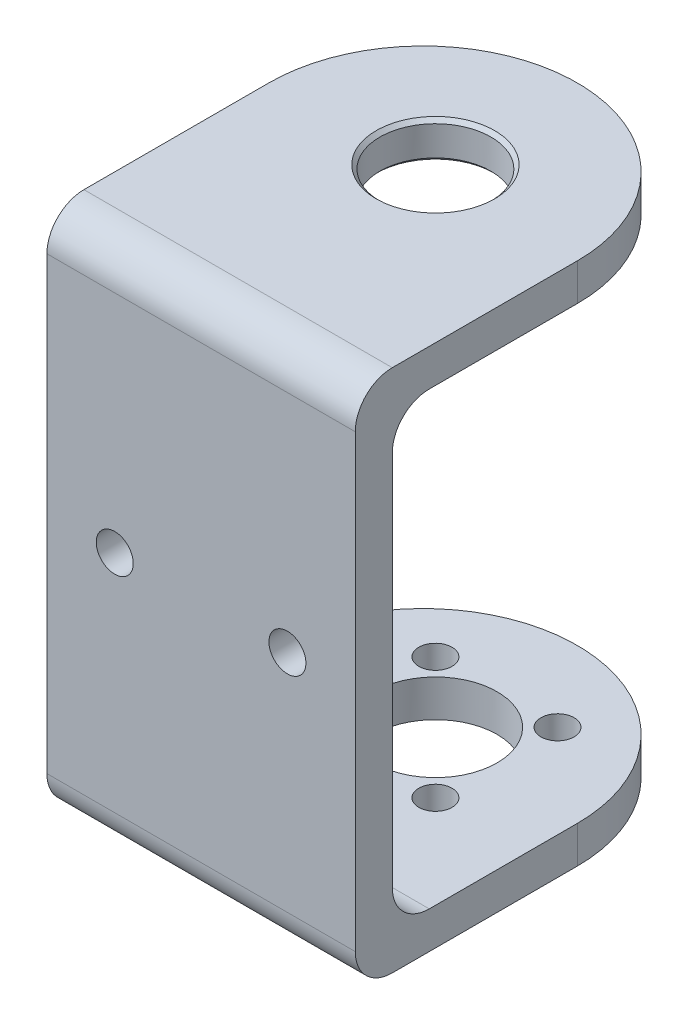
ISO-10303-21;
HEADER;
FILE_DESCRIPTION(('STEP AP214'),'2;1');
FILE_NAME('part.step','',(''),(''),'','','');
FILE_SCHEMA(('AUTOMOTIVE_DESIGN { 1 0 10303 214 1 1 1 1 }'));
ENDSEC;
DATA;
#1=APPLICATION_CONTEXT('core data for automotive mechanical design processes');
#2=APPLICATION_PROTOCOL_DEFINITION('international standard','automotive_design',2000,#1);
#3=PRODUCT_CONTEXT('',#1,'mechanical');
#4=PRODUCT('Part','Part','',(#3));
#5=PRODUCT_RELATED_PRODUCT_CATEGORY('part','',(#4));
#6=PRODUCT_DEFINITION_FORMATION('','',#4);
#7=PRODUCT_DEFINITION_CONTEXT('part definition',#1,'design');
#8=PRODUCT_DEFINITION('design','',#6,#7);
#9=PRODUCT_DEFINITION_SHAPE('','',#8);
#10=(LENGTH_UNIT() NAMED_UNIT(*) SI_UNIT(.MILLI.,.METRE.));
#11=(NAMED_UNIT(*) PLANE_ANGLE_UNIT() SI_UNIT($,.RADIAN.));
#12=(NAMED_UNIT(*) SI_UNIT($,.STERADIAN.) SOLID_ANGLE_UNIT());
#13=UNCERTAINTY_MEASURE_WITH_UNIT(LENGTH_MEASURE(1.E-05),#10,'distance_accuracy_value','');
#14=(GEOMETRIC_REPRESENTATION_CONTEXT(3) GLOBAL_UNCERTAINTY_ASSIGNED_CONTEXT((#13)) GLOBAL_UNIT_ASSIGNED_CONTEXT((#10,
#11,#12)) REPRESENTATION_CONTEXT('',''));
#15=CARTESIAN_POINT('',(0.,0.,0.));
#16=DIRECTION('',(0.,0.,1.));
#17=DIRECTION('',(1.,0.,0.));
#18=AXIS2_PLACEMENT_3D('',#15,#16,#17);
#19=CARTESIAN_POINT('',(-12.5,21.25,-4.00000000000001));
#20=DIRECTION('',(1.,0.,0.));
#21=DIRECTION('',(0.,0.,-1.));
#22=AXIS2_PLACEMENT_3D('',#19,#20,#21);
#23=PLANE('',#22);
#24=DIRECTION('',(0.,0.,1.));
#25=VECTOR('',#24,1.);
#26=CARTESIAN_POINT('',(-12.5,-21.25,-4.00000000000001));
#27=LINE('',#26,#25);
#28=CARTESIAN_POINT('',(-12.5,-21.25,-22.));
#29=VERTEX_POINT('',#28);
#30=CARTESIAN_POINT('',(-12.5,-21.25,-7.00000000000001));
#31=VERTEX_POINT('',#30);
#32=EDGE_CURVE('E333',#29,#31,#27,.T.);
#33=ORIENTED_EDGE('',*,*,#32,.T.);
#34=CARTESIAN_POINT('',(-12.5,-18.25,-7.00000000000001));
#35=DIRECTION('',(1.,0.,0.));
#36=DIRECTION('',(0.,0.,-1.));
#37=AXIS2_PLACEMENT_3D('',#34,#35,#36);
#38=CIRCLE('',#37,3.);
#39=CARTESIAN_POINT('',(-12.5,-18.25,-4.00000000000001));
#40=VERTEX_POINT('',#39);
#41=EDGE_CURVE('E227',#31,#40,#38,.F.);
#42=ORIENTED_EDGE('',*,*,#41,.T.);
#43=DIRECTION('',(0.,-1.,0.));
#44=VECTOR('',#43,1.);
#45=CARTESIAN_POINT('',(-12.5,21.25,-4.00000000000001));
#46=LINE('',#45,#44);
#47=CARTESIAN_POINT('',(-12.5,18.25,-4.00000000000001));
#48=VERTEX_POINT('',#47);
#49=EDGE_CURVE('E177',#48,#40,#46,.T.);
#50=ORIENTED_EDGE('',*,*,#49,.F.);
#51=CARTESIAN_POINT('',(-12.5,18.25,-7.00000000000001));
#52=DIRECTION('',(1.,0.,0.));
#53=DIRECTION('',(0.,0.,-1.));
#54=AXIS2_PLACEMENT_3D('',#51,#52,#53);
#55=CIRCLE('',#54,3.);
#56=CARTESIAN_POINT('',(-12.5,21.25,-7.00000000000001));
#57=VERTEX_POINT('',#56);
#58=EDGE_CURVE('E58',#48,#57,#55,.F.);
#59=ORIENTED_EDGE('',*,*,#58,.T.);
#60=DIRECTION('',(0.,0.,1.));
#61=VECTOR('',#60,1.);
#62=CARTESIAN_POINT('',(-12.5,21.25,-4.00000000000001));
#63=LINE('',#62,#61);
#64=CARTESIAN_POINT('',(-12.5,21.25,-22.));
#65=VERTEX_POINT('',#64);
#66=EDGE_CURVE('E320',#65,#57,#63,.T.);
#67=ORIENTED_EDGE('',*,*,#66,.F.);
#68=DIRECTION('',(0.,-1.,0.));
#69=VECTOR('',#68,1.);
#70=CARTESIAN_POINT('',(-12.5,21.25,-22.));
#71=LINE('',#70,#69);
#72=CARTESIAN_POINT('',(-12.5,18.25,-22.));
#73=VERTEX_POINT('',#72);
#74=EDGE_CURVE('E165',#65,#73,#71,.T.);
#75=ORIENTED_EDGE('',*,*,#74,.T.);
#76=DIRECTION('',(0.,0.,1.));
#77=VECTOR('',#76,1.);
#78=CARTESIAN_POINT('',(-12.5,18.25,-22.));
#79=LINE('',#78,#77);
#80=CARTESIAN_POINT('',(-12.5,18.25,-10.));
#81=VERTEX_POINT('',#80);
#82=EDGE_CURVE('E158',#73,#81,#79,.T.);
#83=ORIENTED_EDGE('',*,*,#82,.T.);
#84=CARTESIAN_POINT('',(-12.5,15.25,-10.));
#85=DIRECTION('',(1.,0.,0.));
#86=DIRECTION('',(0.,0.,-1.));
#87=AXIS2_PLACEMENT_3D('',#84,#85,#86);
#88=CIRCLE('',#87,3.);
#89=CARTESIAN_POINT('',(-12.5,15.25,-7.00000000000001));
#90=VERTEX_POINT('',#89);
#91=EDGE_CURVE('E237',#81,#90,#88,.T.);
#92=ORIENTED_EDGE('',*,*,#91,.T.);
#93=DIRECTION('',(0.,-1.,0.));
#94=VECTOR('',#93,1.);
#95=CARTESIAN_POINT('',(-12.5,21.25,-7.00000000000001));
#96=LINE('',#95,#94);
#97=CARTESIAN_POINT('',(-12.5,-15.25,-7.00000000000001));
#98=VERTEX_POINT('',#97);
#99=EDGE_CURVE('E336',#90,#98,#96,.T.);
#100=ORIENTED_EDGE('',*,*,#99,.T.);
#101=CARTESIAN_POINT('',(-12.5,-15.25,-10.));
#102=DIRECTION('',(1.,0.,0.));
#103=DIRECTION('',(0.,0.,-1.));
#104=AXIS2_PLACEMENT_3D('',#101,#102,#103);
#105=CIRCLE('',#104,3.);
#106=CARTESIAN_POINT('',(-12.5,-18.25,-10.));
#107=VERTEX_POINT('',#106);
#108=EDGE_CURVE('E243',#98,#107,#105,.T.);
#109=ORIENTED_EDGE('',*,*,#108,.T.);
#110=DIRECTION('',(0.,0.,1.));
#111=VECTOR('',#110,1.);
#112=CARTESIAN_POINT('',(-12.5,-18.25,-22.));
#113=LINE('',#112,#111);
#114=CARTESIAN_POINT('',(-12.5,-18.25,-22.));
#115=VERTEX_POINT('',#114);
#116=EDGE_CURVE('E147',#115,#107,#113,.T.);
#117=ORIENTED_EDGE('',*,*,#116,.F.);
#118=EDGE_CURVE('E156',#115,#29,#71,.T.);
#119=ORIENTED_EDGE('',*,*,#118,.T.);
#120=EDGE_LOOP('',(#33,#42,#50,#59,#67,#75,#83,#92,#100,#109,#117,#119));
#121=FACE_BOUND('',#120,.T.);
#122=ADVANCED_FACE('F41',(#121),#23,.F.);
#123=CARTESIAN_POINT('',(12.5,21.25,-4.00000000000001));
#124=DIRECTION('',(-1.,0.,0.));
#125=DIRECTION('',(0.,0.,1.));
#126=AXIS2_PLACEMENT_3D('',#123,#124,#125);
#127=PLANE('',#126);
#128=DIRECTION('',(0.,-1.,0.));
#129=VECTOR('',#128,1.);
#130=CARTESIAN_POINT('',(12.5,21.25,-4.00000000000001));
#131=LINE('',#130,#129);
#132=CARTESIAN_POINT('',(12.5,18.25,-4.00000000000001));
#133=VERTEX_POINT('',#132);
#134=CARTESIAN_POINT('',(12.5,-18.25,-4.00000000000001));
#135=VERTEX_POINT('',#134);
#136=EDGE_CURVE('E170',#133,#135,#131,.T.);
#137=ORIENTED_EDGE('',*,*,#136,.T.);
#138=CARTESIAN_POINT('',(12.5,-18.25,-7.00000000000001));
#139=DIRECTION('',(-1.,0.,0.));
#140=DIRECTION('',(0.,0.,1.));
#141=AXIS2_PLACEMENT_3D('',#138,#139,#140);
#142=CIRCLE('',#141,3.);
#143=CARTESIAN_POINT('',(12.5,-21.25,-7.00000000000001));
#144=VERTEX_POINT('',#143);
#145=EDGE_CURVE('E220',#135,#144,#142,.F.);
#146=ORIENTED_EDGE('',*,*,#145,.T.);
#147=DIRECTION('',(0.,0.,-1.));
#148=VECTOR('',#147,1.);
#149=CARTESIAN_POINT('',(12.5,-21.25,-4.00000000000001));
#150=LINE('',#149,#148);
#151=CARTESIAN_POINT('',(12.5,-21.25,-22.));
#152=VERTEX_POINT('',#151);
#153=EDGE_CURVE('E162',#144,#152,#150,.T.);
#154=ORIENTED_EDGE('',*,*,#153,.T.);
#155=DIRECTION('',(0.,-1.,0.));
#156=VECTOR('',#155,1.);
#157=CARTESIAN_POINT('',(12.5,21.25,-22.));
#158=LINE('',#157,#156);
#159=CARTESIAN_POINT('',(12.5,-18.25,-22.));
#160=VERTEX_POINT('',#159);
#161=EDGE_CURVE('E154',#160,#152,#158,.T.);
#162=ORIENTED_EDGE('',*,*,#161,.F.);
#163=DIRECTION('',(0.,0.,-1.));
#164=VECTOR('',#163,1.);
#165=CARTESIAN_POINT('',(12.5,-18.25,-22.));
#166=LINE('',#165,#164);
#167=CARTESIAN_POINT('',(12.5,-18.25,-10.));
#168=VERTEX_POINT('',#167);
#169=EDGE_CURVE('E136',#168,#160,#166,.T.);
#170=ORIENTED_EDGE('',*,*,#169,.F.);
#171=CARTESIAN_POINT('',(12.5,-15.25,-10.));
#172=DIRECTION('',(-1.,0.,0.));
#173=DIRECTION('',(0.,0.,1.));
#174=AXIS2_PLACEMENT_3D('',#171,#172,#173);
#175=CIRCLE('',#174,3.);
#176=CARTESIAN_POINT('',(12.5,-15.25,-7.00000000000001));
#177=VERTEX_POINT('',#176);
#178=EDGE_CURVE('E240',#168,#177,#175,.T.);
#179=ORIENTED_EDGE('',*,*,#178,.T.);
#180=DIRECTION('',(0.,-1.,0.));
#181=VECTOR('',#180,1.);
#182=CARTESIAN_POINT('',(12.5,21.25,-7.00000000000001));
#183=LINE('',#182,#181);
#184=CARTESIAN_POINT('',(12.5,15.25,-7.00000000000001));
#185=VERTEX_POINT('',#184);
#186=EDGE_CURVE('E386',#185,#177,#183,.T.);
#187=ORIENTED_EDGE('',*,*,#186,.F.);
#188=CARTESIAN_POINT('',(12.5,15.25,-10.));
#189=DIRECTION('',(-1.,0.,0.));
#190=DIRECTION('',(0.,0.,1.));
#191=AXIS2_PLACEMENT_3D('',#188,#189,#190);
#192=CIRCLE('',#191,3.);
#193=CARTESIAN_POINT('',(12.5,18.25,-10.));
#194=VERTEX_POINT('',#193);
#195=EDGE_CURVE('E234',#185,#194,#192,.T.);
#196=ORIENTED_EDGE('',*,*,#195,.T.);
#197=DIRECTION('',(0.,0.,-1.));
#198=VECTOR('',#197,1.);
#199=CARTESIAN_POINT('',(12.5,18.25,-22.));
#200=LINE('',#199,#198);
#201=CARTESIAN_POINT('',(12.5,18.25,-22.));
#202=VERTEX_POINT('',#201);
#203=EDGE_CURVE('E399',#194,#202,#200,.T.);
#204=ORIENTED_EDGE('',*,*,#203,.T.);
#205=CARTESIAN_POINT('',(12.5,21.25,-22.));
#206=VERTEX_POINT('',#205);
#207=EDGE_CURVE('E164',#206,#202,#158,.T.);
#208=ORIENTED_EDGE('',*,*,#207,.F.);
#209=DIRECTION('',(0.,0.,-1.));
#210=VECTOR('',#209,1.);
#211=CARTESIAN_POINT('',(12.5,21.25,-4.00000000000001));
#212=LINE('',#211,#210);
#213=CARTESIAN_POINT('',(12.5,21.25,-7.00000000000001));
#214=VERTEX_POINT('',#213);
#215=EDGE_CURVE('E318',#214,#206,#212,.T.);
#216=ORIENTED_EDGE('',*,*,#215,.F.);
#217=CARTESIAN_POINT('',(12.5,18.25,-7.00000000000001));
#218=DIRECTION('',(-1.,0.,0.));
#219=DIRECTION('',(0.,0.,1.));
#220=AXIS2_PLACEMENT_3D('',#217,#218,#219);
#221=CIRCLE('',#220,3.);
#222=EDGE_CURVE('E217',#214,#133,#221,.F.);
#223=ORIENTED_EDGE('',*,*,#222,.T.);
#224=EDGE_LOOP('',(#137,#146,#154,#162,#170,#179,#187,#196,#204,#208,#216,#223));
#225=FACE_BOUND('',#224,.T.);
#226=ADVANCED_FACE('F161',(#225),#127,.F.);
#227=CARTESIAN_POINT('',(0.,21.25,-22.));
#228=DIRECTION('',(0.,-1.,0.));
#229=DIRECTION('',(0.,0.,-1.));
#230=AXIS2_PLACEMENT_3D('',#227,#228,#229);
#231=CYLINDRICAL_SURFACE('',#230,12.5);
#232=CARTESIAN_POINT('',(0.,-18.25,-22.));
#233=DIRECTION('',(0.,-1.,0.));
#234=DIRECTION('',(0.,0.,-1.));
#235=AXIS2_PLACEMENT_3D('',#232,#233,#234);
#236=CIRCLE('',#235,12.5);
#237=EDGE_CURVE('E140',#160,#115,#236,.F.);
#238=ORIENTED_EDGE('',*,*,#237,.F.);
#239=ORIENTED_EDGE('',*,*,#161,.T.);
#240=CARTESIAN_POINT('',(0.,-21.25,-22.));
#241=DIRECTION('',(0.,1.,0.));
#242=DIRECTION('',(0.,0.,-1.));
#243=AXIS2_PLACEMENT_3D('',#240,#241,#242);
#244=CIRCLE('',#243,12.5);
#245=EDGE_CURVE('E329',#152,#29,#244,.T.);
#246=ORIENTED_EDGE('',*,*,#245,.T.);
#247=ORIENTED_EDGE('',*,*,#118,.F.);
#248=EDGE_LOOP('',(#238,#239,#246,#247));
#249=FACE_BOUND('',#248,.T.);
#250=ADVANCED_FACE('F152',(#249),#231,.T.);
#251=CARTESIAN_POINT('',(-12.5,21.25,-4.00000000000001));
#252=DIRECTION('',(0.,0.,-1.));
#253=DIRECTION('',(-1.,0.,0.));
#254=AXIS2_PLACEMENT_3D('',#251,#252,#253);
#255=PLANE('',#254);
#256=CARTESIAN_POINT('',(7.,0.,-4.00000000000001));
#257=DIRECTION('',(0.,0.,-1.));
#258=DIRECTION('',(-1.,0.,0.));
#259=AXIS2_PLACEMENT_3D('',#256,#257,#258);
#260=CIRCLE('',#259,1.5);
#261=CARTESIAN_POINT('',(5.5,0.,-4.00000000000001));
#262=VERTEX_POINT('',#261);
#263=EDGE_CURVE('E355',#262,#262,#260,.T.);
#264=ORIENTED_EDGE('',*,*,#263,.T.);
#265=EDGE_LOOP('',(#264));
#266=FACE_BOUND('',#265,.T.);
#267=CARTESIAN_POINT('',(-7.,0.,-4.00000000000001));
#268=DIRECTION('',(0.,0.,-1.));
#269=DIRECTION('',(-1.,0.,0.));
#270=AXIS2_PLACEMENT_3D('',#267,#268,#269);
#271=CIRCLE('',#270,1.5);
#272=CARTESIAN_POINT('',(-8.5,0.,-4.00000000000001));
#273=VERTEX_POINT('',#272);
#274=EDGE_CURVE('E358',#273,#273,#271,.T.);
#275=ORIENTED_EDGE('',*,*,#274,.T.);
#276=EDGE_LOOP('',(#275));
#277=FACE_BOUND('',#276,.T.);
#278=ORIENTED_EDGE('',*,*,#49,.T.);
#279=DIRECTION('',(1.,0.,0.));
#280=VECTOR('',#279,1.);
#281=CARTESIAN_POINT('',(12.5,-18.25,-4.00000000000001));
#282=LINE('',#281,#280);
#283=EDGE_CURVE('E213',#40,#135,#282,.T.);
#284=ORIENTED_EDGE('',*,*,#283,.T.);
#285=ORIENTED_EDGE('',*,*,#136,.F.);
#286=DIRECTION('',(1.,0.,0.));
#287=VECTOR('',#286,1.);
#288=CARTESIAN_POINT('',(-12.5,18.25,-4.00000000000001));
#289=LINE('',#288,#287);
#290=EDGE_CURVE('E210',#133,#48,#289,.F.);
#291=ORIENTED_EDGE('',*,*,#290,.T.);
#292=EDGE_LOOP('',(#278,#284,#285,#291));
#293=FACE_BOUND('',#292,.T.);
#294=ADVANCED_FACE('F286',(#266,#277,#293),#255,.F.);
#295=ORIENTED_EDGE('',*,*,#207,.T.);
#296=CARTESIAN_POINT('',(0.,18.25,-22.));
#297=DIRECTION('',(0.,-1.,0.));
#298=DIRECTION('',(0.,0.,-1.));
#299=AXIS2_PLACEMENT_3D('',#296,#297,#298);
#300=CIRCLE('',#299,12.5);
#301=EDGE_CURVE('E389',#202,#73,#300,.F.);
#302=ORIENTED_EDGE('',*,*,#301,.T.);
#303=ORIENTED_EDGE('',*,*,#74,.F.);
#304=CARTESIAN_POINT('',(0.,21.25,-22.));
#305=DIRECTION('',(0.,1.,0.));
#306=DIRECTION('',(0.,0.,-1.));
#307=AXIS2_PLACEMENT_3D('',#304,#305,#306);
#308=CIRCLE('',#307,12.5);
#309=EDGE_CURVE('E324',#206,#65,#308,.T.);
#310=ORIENTED_EDGE('',*,*,#309,.F.);
#311=EDGE_LOOP('',(#295,#302,#303,#310));
#312=FACE_BOUND('',#311,.T.);
#313=ADVANCED_FACE('F344',(#312),#231,.T.);
#314=CARTESIAN_POINT('',(0.,21.25,-22.));
#315=DIRECTION('',(0.,-1.,0.));
#316=DIRECTION('',(0.,0.,-1.));
#317=AXIS2_PLACEMENT_3D('',#314,#315,#316);
#318=PLANE('',#317);
#319=CARTESIAN_POINT('',(0.,21.25,-23.));
#320=DIRECTION('',(0.,-1.,0.));
#321=DIRECTION('',(0.,0.,-1.));
#322=AXIS2_PLACEMENT_3D('',#319,#320,#321);
#323=CIRCLE('',#322,4.80000000000001);
#324=CARTESIAN_POINT('',(0.,21.25,-18.2));
#325=VERTEX_POINT('',#324);
#326=EDGE_CURVE('E11',#325,#325,#323,.T.);
#327=ORIENTED_EDGE('',*,*,#326,.T.);
#328=EDGE_LOOP('',(#327));
#329=FACE_BOUND('',#328,.T.);
#330=ORIENTED_EDGE('',*,*,#66,.T.);
#331=DIRECTION('',(1.,0.,0.));
#332=VECTOR('',#331,1.);
#333=CARTESIAN_POINT('',(0.,21.25,-7.00000000000001));
#334=LINE('',#333,#332);
#335=EDGE_CURVE('E230',#57,#214,#334,.T.);
#336=ORIENTED_EDGE('',*,*,#335,.T.);
#337=ORIENTED_EDGE('',*,*,#215,.T.);
#338=ORIENTED_EDGE('',*,*,#309,.T.);
#339=EDGE_LOOP('',(#330,#336,#337,#338));
#340=FACE_BOUND('',#339,.T.);
#341=ADVANCED_FACE('F317',(#329,#340),#318,.F.);
#342=CARTESIAN_POINT('',(0.,-21.25,-22.));
#343=DIRECTION('',(0.,-1.,0.));
#344=DIRECTION('',(0.,0.,-1.));
#345=AXIS2_PLACEMENT_3D('',#342,#343,#344);
#346=PLANE('',#345);
#347=CARTESIAN_POINT('',(0.,-21.25,-23.));
#348=DIRECTION('',(0.,-1.,0.));
#349=DIRECTION('',(0.,0.,-1.));
#350=AXIS2_PLACEMENT_3D('',#347,#348,#349);
#351=CIRCLE('',#350,5.);
#352=CARTESIAN_POINT('',(0.,-21.25,-28.));
#353=VERTEX_POINT('',#352);
#354=EDGE_CURVE('E587',#353,#353,#351,.T.);
#355=ORIENTED_EDGE('',*,*,#354,.F.);
#356=EDGE_LOOP('',(#355));
#357=FACE_BOUND('',#356,.T.);
#358=CARTESIAN_POINT('',(-4.94974746830582,-21.25,-27.9497474683058));
#359=DIRECTION('',(0.,-1.,0.));
#360=DIRECTION('',(0.,0.,-1.));
#361=AXIS2_PLACEMENT_3D('',#358,#359,#360);
#362=CIRCLE('',#361,1.34733649607319);
#363=CARTESIAN_POINT('',(-4.94974746830582,-21.25,-29.297083964379));
#364=VERTEX_POINT('',#363);
#365=EDGE_CURVE('E365',#364,#364,#362,.T.);
#366=ORIENTED_EDGE('',*,*,#365,.F.);
#367=EDGE_LOOP('',(#366));
#368=FACE_BOUND('',#367,.T.);
#369=CARTESIAN_POINT('',(4.94974746830584,-21.25,-27.9497474683058));
#370=DIRECTION('',(0.,-1.,0.));
#371=DIRECTION('',(0.,0.,-1.));
#372=AXIS2_PLACEMENT_3D('',#369,#370,#371);
#373=CIRCLE('',#372,1.34733649607319);
#374=CARTESIAN_POINT('',(4.94974746830584,-21.25,-29.297083964379));
#375=VERTEX_POINT('',#374);
#376=EDGE_CURVE('E376',#375,#375,#373,.T.);
#377=ORIENTED_EDGE('',*,*,#376,.F.);
#378=EDGE_LOOP('',(#377));
#379=FACE_BOUND('',#378,.T.);
#380=CARTESIAN_POINT('',(4.94974746830582,-21.25,-18.0502525316942));
#381=DIRECTION('',(0.,-1.,0.));
#382=DIRECTION('',(0.,0.,-1.));
#383=AXIS2_PLACEMENT_3D('',#380,#381,#382);
#384=CIRCLE('',#383,1.34733649607319);
#385=CARTESIAN_POINT('',(4.94974746830582,-21.25,-19.3975890277673));
#386=VERTEX_POINT('',#385);
#387=EDGE_CURVE('E372',#386,#386,#384,.T.);
#388=ORIENTED_EDGE('',*,*,#387,.F.);
#389=EDGE_LOOP('',(#388));
#390=FACE_BOUND('',#389,.T.);
#391=CARTESIAN_POINT('',(-4.94974746830584,-21.25,-18.0502525316942));
#392=DIRECTION('',(0.,-1.,0.));
#393=DIRECTION('',(0.,0.,-1.));
#394=AXIS2_PLACEMENT_3D('',#391,#392,#393);
#395=CIRCLE('',#394,1.34733649607317);
#396=CARTESIAN_POINT('',(-4.94974746830584,-21.25,-19.3975890277673));
#397=VERTEX_POINT('',#396);
#398=EDGE_CURVE('E187',#397,#397,#395,.T.);
#399=ORIENTED_EDGE('',*,*,#398,.F.);
#400=EDGE_LOOP('',(#399));
#401=FACE_BOUND('',#400,.T.);
#402=ORIENTED_EDGE('',*,*,#153,.F.);
#403=DIRECTION('',(1.,0.,0.));
#404=VECTOR('',#403,1.);
#405=CARTESIAN_POINT('',(-12.5,-21.25,-7.00000000000001));
#406=LINE('',#405,#404);
#407=EDGE_CURVE('E66',#144,#31,#406,.F.);
#408=ORIENTED_EDGE('',*,*,#407,.T.);
#409=ORIENTED_EDGE('',*,*,#32,.F.);
#410=ORIENTED_EDGE('',*,*,#245,.F.);
#411=EDGE_LOOP('',(#402,#408,#409,#410));
#412=FACE_BOUND('',#411,.T.);
#413=ADVANCED_FACE('F339',(#357,#368,#379,#390,#401,#412),#346,.T.);
#414=CARTESIAN_POINT('',(-12.5,21.25,-7.00000000000001));
#415=DIRECTION('',(0.,0.,-1.));
#416=DIRECTION('',(-1.,0.,0.));
#417=AXIS2_PLACEMENT_3D('',#414,#415,#416);
#418=PLANE('',#417);
#419=CARTESIAN_POINT('',(7.,0.,-7.00000000000001));
#420=DIRECTION('',(0.,0.,-1.));
#421=DIRECTION('',(-1.,0.,0.));
#422=AXIS2_PLACEMENT_3D('',#419,#420,#421);
#423=CIRCLE('',#422,1.5);
#424=CARTESIAN_POINT('',(5.5,0.,-7.00000000000001));
#425=VERTEX_POINT('',#424);
#426=EDGE_CURVE('E361',#425,#425,#423,.T.);
#427=ORIENTED_EDGE('',*,*,#426,.F.);
#428=EDGE_LOOP('',(#427));
#429=FACE_BOUND('',#428,.T.);
#430=CARTESIAN_POINT('',(-7.,0.,-7.00000000000001));
#431=DIRECTION('',(0.,0.,-1.));
#432=DIRECTION('',(-1.,0.,0.));
#433=AXIS2_PLACEMENT_3D('',#430,#431,#432);
#434=CIRCLE('',#433,1.5);
#435=CARTESIAN_POINT('',(-8.5,0.,-7.00000000000001));
#436=VERTEX_POINT('',#435);
#437=EDGE_CURVE('E368',#436,#436,#434,.T.);
#438=ORIENTED_EDGE('',*,*,#437,.F.);
#439=EDGE_LOOP('',(#438));
#440=FACE_BOUND('',#439,.T.);
#441=ORIENTED_EDGE('',*,*,#99,.F.);
#442=DIRECTION('',(1.,0.,0.));
#443=VECTOR('',#442,1.);
#444=CARTESIAN_POINT('',(12.5,15.25,-7.00000000000001));
#445=LINE('',#444,#443);
#446=EDGE_CURVE('E201',#90,#185,#445,.T.);
#447=ORIENTED_EDGE('',*,*,#446,.T.);
#448=ORIENTED_EDGE('',*,*,#186,.T.);
#449=DIRECTION('',(1.,0.,0.));
#450=VECTOR('',#449,1.);
#451=CARTESIAN_POINT('',(-12.5,-15.25,-7.00000000000001));
#452=LINE('',#451,#450);
#453=EDGE_CURVE('E181',#177,#98,#452,.F.);
#454=ORIENTED_EDGE('',*,*,#453,.T.);
#455=EDGE_LOOP('',(#441,#447,#448,#454));
#456=FACE_BOUND('',#455,.T.);
#457=ADVANCED_FACE('F412',(#429,#440,#456),#418,.T.);
#458=CARTESIAN_POINT('',(0.,18.25,-22.));
#459=DIRECTION('',(0.,-1.,0.));
#460=DIRECTION('',(0.,0.,-1.));
#461=AXIS2_PLACEMENT_3D('',#458,#459,#460);
#462=PLANE('',#461);
#463=CARTESIAN_POINT('',(0.,18.25,-23.));
#464=DIRECTION('',(0.,-1.,0.));
#465=DIRECTION('',(0.,0.,-1.));
#466=AXIS2_PLACEMENT_3D('',#463,#464,#465);
#467=CIRCLE('',#466,4.80000000000001);
#468=CARTESIAN_POINT('',(0.,18.25,-27.8));
#469=VERTEX_POINT('',#468);
#470=EDGE_CURVE('E51',#469,#469,#467,.F.);
#471=ORIENTED_EDGE('',*,*,#470,.T.);
#472=EDGE_LOOP('',(#471));
#473=FACE_BOUND('',#472,.T.);
#474=ORIENTED_EDGE('',*,*,#203,.F.);
#475=DIRECTION('',(1.,0.,0.));
#476=VECTOR('',#475,1.);
#477=CARTESIAN_POINT('',(-12.5,18.25,-10.));
#478=LINE('',#477,#476);
#479=EDGE_CURVE('E205',#194,#81,#478,.F.);
#480=ORIENTED_EDGE('',*,*,#479,.T.);
#481=ORIENTED_EDGE('',*,*,#82,.F.);
#482=ORIENTED_EDGE('',*,*,#301,.F.);
#483=EDGE_LOOP('',(#474,#480,#481,#482));
#484=FACE_BOUND('',#483,.T.);
#485=ADVANCED_FACE('F257',(#473,#484),#462,.T.);
#486=CARTESIAN_POINT('',(0.,-18.25,-22.));
#487=DIRECTION('',(0.,-1.,0.));
#488=DIRECTION('',(0.,0.,-1.));
#489=AXIS2_PLACEMENT_3D('',#486,#487,#488);
#490=PLANE('',#489);
#491=CARTESIAN_POINT('',(0.,-18.25,-23.));
#492=DIRECTION('',(0.,1.,0.));
#493=DIRECTION('',(0.,0.,1.));
#494=AXIS2_PLACEMENT_3D('',#491,#492,#493);
#495=CIRCLE('',#494,5.);
#496=CARTESIAN_POINT('',(0.,-18.25,-18.));
#497=VERTEX_POINT('',#496);
#498=EDGE_CURVE('E590',#497,#497,#495,.T.);
#499=ORIENTED_EDGE('',*,*,#498,.F.);
#500=EDGE_LOOP('',(#499));
#501=FACE_BOUND('',#500,.T.);
#502=CARTESIAN_POINT('',(-4.94974746830582,-18.25,-27.9497474683058));
#503=DIRECTION('',(0.,-1.,0.));
#504=DIRECTION('',(0.,0.,-1.));
#505=AXIS2_PLACEMENT_3D('',#502,#503,#504);
#506=CIRCLE('',#505,1.34733649607319);
#507=CARTESIAN_POINT('',(-4.94974746830582,-18.25,-29.297083964379));
#508=VERTEX_POINT('',#507);
#509=EDGE_CURVE('E195',#508,#508,#506,.T.);
#510=ORIENTED_EDGE('',*,*,#509,.T.);
#511=EDGE_LOOP('',(#510));
#512=FACE_BOUND('',#511,.T.);
#513=CARTESIAN_POINT('',(4.94974746830584,-18.25,-27.9497474683058));
#514=DIRECTION('',(0.,-1.,0.));
#515=DIRECTION('',(0.,0.,-1.));
#516=AXIS2_PLACEMENT_3D('',#513,#514,#515);
#517=CIRCLE('',#516,1.34733649607319);
#518=CARTESIAN_POINT('',(4.94974746830584,-18.25,-29.297083964379));
#519=VERTEX_POINT('',#518);
#520=EDGE_CURVE('E191',#519,#519,#517,.T.);
#521=ORIENTED_EDGE('',*,*,#520,.T.);
#522=EDGE_LOOP('',(#521));
#523=FACE_BOUND('',#522,.T.);
#524=CARTESIAN_POINT('',(4.94974746830582,-18.25,-18.0502525316942));
#525=DIRECTION('',(0.,-1.,0.));
#526=DIRECTION('',(0.,0.,-1.));
#527=AXIS2_PLACEMENT_3D('',#524,#525,#526);
#528=CIRCLE('',#527,1.34733649607319);
#529=CARTESIAN_POINT('',(4.94974746830582,-18.25,-19.3975890277673));
#530=VERTEX_POINT('',#529);
#531=EDGE_CURVE('E186',#530,#530,#528,.T.);
#532=ORIENTED_EDGE('',*,*,#531,.T.);
#533=EDGE_LOOP('',(#532));
#534=FACE_BOUND('',#533,.T.);
#535=CARTESIAN_POINT('',(-4.94974746830584,-18.25,-18.0502525316942));
#536=DIRECTION('',(0.,-1.,0.));
#537=DIRECTION('',(0.,0.,-1.));
#538=AXIS2_PLACEMENT_3D('',#535,#536,#537);
#539=CIRCLE('',#538,1.34733649607317);
#540=CARTESIAN_POINT('',(-4.94974746830584,-18.25,-19.3975890277673));
#541=VERTEX_POINT('',#540);
#542=EDGE_CURVE('E182',#541,#541,#539,.T.);
#543=ORIENTED_EDGE('',*,*,#542,.T.);
#544=EDGE_LOOP('',(#543));
#545=FACE_BOUND('',#544,.T.);
#546=ORIENTED_EDGE('',*,*,#116,.T.);
#547=DIRECTION('',(1.,0.,0.));
#548=VECTOR('',#547,1.);
#549=CARTESIAN_POINT('',(0.,-18.25,-10.));
#550=LINE('',#549,#548);
#551=EDGE_CURVE('E143',#107,#168,#550,.T.);
#552=ORIENTED_EDGE('',*,*,#551,.T.);
#553=ORIENTED_EDGE('',*,*,#169,.T.);
#554=ORIENTED_EDGE('',*,*,#237,.T.);
#555=EDGE_LOOP('',(#546,#552,#553,#554));
#556=FACE_BOUND('',#555,.T.);
#557=ADVANCED_FACE('F139',(#501,#512,#523,#534,#545,#556),#490,.F.);
#558=CARTESIAN_POINT('',(0.,12.75,-23.));
#559=DIRECTION('',(0.,1.,0.));
#560=DIRECTION('',(0.,0.,1.));
#561=AXIS2_PLACEMENT_3D('',#558,#559,#560);
#562=CYLINDRICAL_SURFACE('',#561,4.5);
#563=CARTESIAN_POINT('',(0.,18.55,-23.));
#564=DIRECTION('',(0.,-1.,0.));
#565=DIRECTION('',(0.,0.,-1.));
#566=AXIS2_PLACEMENT_3D('',#563,#564,#565);
#567=CIRCLE('',#566,4.5);
#568=CARTESIAN_POINT('',(0.,18.55,-27.5));
#569=VERTEX_POINT('',#568);
#570=EDGE_CURVE('E250',#569,#569,#567,.T.);
#571=ORIENTED_EDGE('',*,*,#570,.T.);
#572=EDGE_LOOP('',(#571));
#573=FACE_BOUND('',#572,.T.);
#574=CARTESIAN_POINT('',(0.,20.95,-23.));
#575=DIRECTION('',(0.,-1.,0.));
#576=DIRECTION('',(0.,0.,-1.));
#577=AXIS2_PLACEMENT_3D('',#574,#575,#576);
#578=CIRCLE('',#577,4.5);
#579=CARTESIAN_POINT('',(0.,20.95,-18.5));
#580=VERTEX_POINT('',#579);
#581=EDGE_CURVE('E246',#580,#580,#578,.F.);
#582=ORIENTED_EDGE('',*,*,#581,.T.);
#583=EDGE_LOOP('',(#582));
#584=FACE_BOUND('',#583,.T.);
#585=ADVANCED_FACE('F266',(#573,#584),#562,.F.);
#586=CARTESIAN_POINT('',(-4.94974746830584,-15.25,-18.0502525316942));
#587=DIRECTION('',(0.,-1.,0.));
#588=DIRECTION('',(0.,0.,-1.));
#589=AXIS2_PLACEMENT_3D('',#586,#587,#588);
#590=CYLINDRICAL_SURFACE('',#589,1.34733649607317);
#591=ORIENTED_EDGE('',*,*,#398,.T.);
#592=EDGE_LOOP('',(#591));
#593=FACE_BOUND('',#592,.T.);
#594=ORIENTED_EDGE('',*,*,#542,.F.);
#595=EDGE_LOOP('',(#594));
#596=FACE_BOUND('',#595,.T.);
#597=ADVANCED_FACE('F269',(#593,#596),#590,.F.);
#598=CARTESIAN_POINT('',(4.94974746830582,-15.25,-18.0502525316942));
#599=DIRECTION('',(0.,-1.,0.));
#600=DIRECTION('',(0.,0.,-1.));
#601=AXIS2_PLACEMENT_3D('',#598,#599,#600);
#602=CYLINDRICAL_SURFACE('',#601,1.34733649607319);
#603=ORIENTED_EDGE('',*,*,#387,.T.);
#604=EDGE_LOOP('',(#603));
#605=FACE_BOUND('',#604,.T.);
#606=ORIENTED_EDGE('',*,*,#531,.F.);
#607=EDGE_LOOP('',(#606));
#608=FACE_BOUND('',#607,.T.);
#609=ADVANCED_FACE('F514',(#605,#608),#602,.F.);
#610=CARTESIAN_POINT('',(4.94974746830584,-15.25,-27.9497474683058));
#611=DIRECTION('',(0.,-1.,0.));
#612=DIRECTION('',(0.,0.,-1.));
#613=AXIS2_PLACEMENT_3D('',#610,#611,#612);
#614=CYLINDRICAL_SURFACE('',#613,1.34733649607319);
#615=ORIENTED_EDGE('',*,*,#376,.T.);
#616=EDGE_LOOP('',(#615));
#617=FACE_BOUND('',#616,.T.);
#618=ORIENTED_EDGE('',*,*,#520,.F.);
#619=EDGE_LOOP('',(#618));
#620=FACE_BOUND('',#619,.T.);
#621=ADVANCED_FACE('F523',(#617,#620),#614,.F.);
#622=CARTESIAN_POINT('',(-4.94974746830582,-15.25,-27.9497474683058));
#623=DIRECTION('',(0.,-1.,0.));
#624=DIRECTION('',(0.,0.,-1.));
#625=AXIS2_PLACEMENT_3D('',#622,#623,#624);
#626=CYLINDRICAL_SURFACE('',#625,1.34733649607319);
#627=ORIENTED_EDGE('',*,*,#365,.T.);
#628=EDGE_LOOP('',(#627));
#629=FACE_BOUND('',#628,.T.);
#630=ORIENTED_EDGE('',*,*,#509,.F.);
#631=EDGE_LOOP('',(#630));
#632=FACE_BOUND('',#631,.T.);
#633=ADVANCED_FACE('F533',(#629,#632),#626,.F.);
#634=CARTESIAN_POINT('',(-7.,0.,2.99999999999999));
#635=DIRECTION('',(0.,0.,-1.));
#636=DIRECTION('',(-1.,0.,0.));
#637=AXIS2_PLACEMENT_3D('',#634,#635,#636);
#638=CYLINDRICAL_SURFACE('',#637,1.5);
#639=ORIENTED_EDGE('',*,*,#437,.T.);
#640=EDGE_LOOP('',(#639));
#641=FACE_BOUND('',#640,.T.);
#642=ORIENTED_EDGE('',*,*,#274,.F.);
#643=EDGE_LOOP('',(#642));
#644=FACE_BOUND('',#643,.T.);
#645=ADVANCED_FACE('F543',(#641,#644),#638,.F.);
#646=CARTESIAN_POINT('',(7.,0.,2.99999999999999));
#647=DIRECTION('',(0.,0.,-1.));
#648=DIRECTION('',(-1.,0.,0.));
#649=AXIS2_PLACEMENT_3D('',#646,#647,#648);
#650=CYLINDRICAL_SURFACE('',#649,1.5);
#651=ORIENTED_EDGE('',*,*,#426,.T.);
#652=EDGE_LOOP('',(#651));
#653=FACE_BOUND('',#652,.T.);
#654=ORIENTED_EDGE('',*,*,#263,.F.);
#655=EDGE_LOOP('',(#654));
#656=FACE_BOUND('',#655,.T.);
#657=ADVANCED_FACE('F291',(#653,#656),#650,.F.);
#658=CARTESIAN_POINT('',(-12.5,15.25,-10.));
#659=DIRECTION('',(-1.,0.,0.));
#660=DIRECTION('',(0.,0.,1.));
#661=AXIS2_PLACEMENT_3D('',#658,#659,#660);
#662=CYLINDRICAL_SURFACE('',#661,3.);
#663=ORIENTED_EDGE('',*,*,#91,.F.);
#664=ORIENTED_EDGE('',*,*,#479,.F.);
#665=ORIENTED_EDGE('',*,*,#195,.F.);
#666=ORIENTED_EDGE('',*,*,#446,.F.);
#667=EDGE_LOOP('',(#663,#664,#665,#666));
#668=FACE_BOUND('',#667,.T.);
#669=ADVANCED_FACE('F287',(#668),#662,.F.);
#670=CARTESIAN_POINT('',(0.,-15.25,-10.));
#671=DIRECTION('',(1.,0.,0.));
#672=DIRECTION('',(0.,0.,-1.));
#673=AXIS2_PLACEMENT_3D('',#670,#671,#672);
#674=CYLINDRICAL_SURFACE('',#673,3.);
#675=ORIENTED_EDGE('',*,*,#108,.F.);
#676=ORIENTED_EDGE('',*,*,#453,.F.);
#677=ORIENTED_EDGE('',*,*,#178,.F.);
#678=ORIENTED_EDGE('',*,*,#551,.F.);
#679=EDGE_LOOP('',(#675,#676,#677,#678));
#680=FACE_BOUND('',#679,.T.);
#681=ADVANCED_FACE('F290',(#680),#674,.F.);
#682=CARTESIAN_POINT('',(-12.5,-18.25,-7.00000000000001));
#683=DIRECTION('',(-1.,0.,0.));
#684=DIRECTION('',(0.,0.,1.));
#685=AXIS2_PLACEMENT_3D('',#682,#683,#684);
#686=CYLINDRICAL_SURFACE('',#685,3.);
#687=ORIENTED_EDGE('',*,*,#41,.F.);
#688=ORIENTED_EDGE('',*,*,#407,.F.);
#689=ORIENTED_EDGE('',*,*,#145,.F.);
#690=ORIENTED_EDGE('',*,*,#283,.F.);
#691=EDGE_LOOP('',(#687,#688,#689,#690));
#692=FACE_BOUND('',#691,.T.);
#693=ADVANCED_FACE('F295',(#692),#686,.T.);
#694=CARTESIAN_POINT('',(0.,18.25,-7.00000000000001));
#695=DIRECTION('',(1.,0.,0.));
#696=DIRECTION('',(0.,0.,-1.));
#697=AXIS2_PLACEMENT_3D('',#694,#695,#696);
#698=CYLINDRICAL_SURFACE('',#697,3.);
#699=ORIENTED_EDGE('',*,*,#58,.F.);
#700=ORIENTED_EDGE('',*,*,#290,.F.);
#701=ORIENTED_EDGE('',*,*,#222,.F.);
#702=ORIENTED_EDGE('',*,*,#335,.F.);
#703=EDGE_LOOP('',(#699,#700,#701,#702));
#704=FACE_BOUND('',#703,.T.);
#705=ADVANCED_FACE('F299',(#704),#698,.T.);
#706=CARTESIAN_POINT('',(0.,-28.25,-23.));
#707=DIRECTION('',(0.,1.,0.));
#708=DIRECTION('',(0.,0.,1.));
#709=AXIS2_PLACEMENT_3D('',#706,#707,#708);
#710=CYLINDRICAL_SURFACE('',#709,5.);
#711=ORIENTED_EDGE('',*,*,#354,.T.);
#712=EDGE_LOOP('',(#711));
#713=FACE_BOUND('',#712,.T.);
#714=ORIENTED_EDGE('',*,*,#498,.T.);
#715=EDGE_LOOP('',(#714));
#716=FACE_BOUND('',#715,.T.);
#717=ADVANCED_FACE('F263',(#713,#716),#710,.F.);
#718=CARTESIAN_POINT('',(0.,18.55,-23.));
#719=DIRECTION('',(0.,-1.,0.));
#720=DIRECTION('',(0.,0.,-1.));
#721=AXIS2_PLACEMENT_3D('',#718,#719,#720);
#722=CONICAL_SURFACE('',#721,4.5,0.78539816339745);
#723=ORIENTED_EDGE('',*,*,#470,.F.);
#724=EDGE_LOOP('',(#723));
#725=FACE_BOUND('',#724,.T.);
#726=ORIENTED_EDGE('',*,*,#570,.F.);
#727=EDGE_LOOP('',(#726));
#728=FACE_BOUND('',#727,.T.);
#729=ADVANCED_FACE('F260',(#725,#728),#722,.F.);
#730=CARTESIAN_POINT('',(0.,20.95,-23.));
#731=DIRECTION('',(0.,1.,0.));
#732=DIRECTION('',(0.,0.,1.));
#733=AXIS2_PLACEMENT_3D('',#730,#731,#732);
#734=CONICAL_SURFACE('',#733,4.5,0.78539816339745);
#735=CARTESIAN_POINT('',(0.,21.25,-18.2));
#736=CARTESIAN_POINT('',(0.,21.246875,-18.203125));
#737=CARTESIAN_POINT('',(0.,21.24375,-18.20625));
#738=CARTESIAN_POINT('',(0.,21.2375,-18.2125));
#739=CARTESIAN_POINT('',(0.,21.234375,-18.215625));
#740=CARTESIAN_POINT('',(0.,21.228125,-18.221875));
#741=CARTESIAN_POINT('',(0.,21.225,-18.225));
#742=CARTESIAN_POINT('',(0.,21.21875,-18.23125));
#743=CARTESIAN_POINT('',(0.,21.215625,-18.234375));
#744=CARTESIAN_POINT('',(0.,21.209375,-18.240625));
#745=CARTESIAN_POINT('',(0.,21.20625,-18.24375));
#746=CARTESIAN_POINT('',(0.,21.2,-18.25));
#747=CARTESIAN_POINT('',(0.,21.196875,-18.253125));
#748=CARTESIAN_POINT('',(0.,21.190625,-18.259375));
#749=CARTESIAN_POINT('',(0.,21.1875,-18.2625));
#750=CARTESIAN_POINT('',(0.,21.18125,-18.26875));
#751=CARTESIAN_POINT('',(0.,21.178125,-18.271875));
#752=CARTESIAN_POINT('',(0.,21.171875,-18.278125));
#753=CARTESIAN_POINT('',(0.,21.16875,-18.28125));
#754=CARTESIAN_POINT('',(0.,21.1625,-18.2875));
#755=CARTESIAN_POINT('',(0.,21.159375,-18.290625));
#756=CARTESIAN_POINT('',(0.,21.153125,-18.296875));
#757=CARTESIAN_POINT('',(0.,21.15,-18.3));
#758=CARTESIAN_POINT('',(0.,21.14375,-18.30625));
#759=CARTESIAN_POINT('',(0.,21.140625,-18.309375));
#760=CARTESIAN_POINT('',(0.,21.134375,-18.315625));
#761=CARTESIAN_POINT('',(0.,21.13125,-18.31875));
#762=CARTESIAN_POINT('',(0.,21.125,-18.325));
#763=CARTESIAN_POINT('',(0.,21.121875,-18.328125));
#764=CARTESIAN_POINT('',(0.,21.115625,-18.334375));
#765=CARTESIAN_POINT('',(0.,21.1125,-18.3375));
#766=CARTESIAN_POINT('',(0.,21.10625,-18.34375));
#767=CARTESIAN_POINT('',(0.,21.103125,-18.346875));
#768=CARTESIAN_POINT('',(0.,21.096875,-18.353125));
#769=CARTESIAN_POINT('',(0.,21.09375,-18.35625));
#770=CARTESIAN_POINT('',(0.,21.0875,-18.3625));
#771=CARTESIAN_POINT('',(0.,21.084375,-18.365625));
#772=CARTESIAN_POINT('',(0.,21.078125,-18.371875));
#773=CARTESIAN_POINT('',(0.,21.075,-18.375));
#774=CARTESIAN_POINT('',(0.,21.06875,-18.38125));
#775=CARTESIAN_POINT('',(0.,21.065625,-18.384375));
#776=CARTESIAN_POINT('',(0.,21.059375,-18.390625));
#777=CARTESIAN_POINT('',(0.,21.05625,-18.39375));
#778=CARTESIAN_POINT('',(0.,21.05,-18.4));
#779=CARTESIAN_POINT('',(0.,21.046875,-18.403125));
#780=CARTESIAN_POINT('',(0.,21.040625,-18.409375));
#781=CARTESIAN_POINT('',(0.,21.0375,-18.4125));
#782=CARTESIAN_POINT('',(0.,21.03125,-18.41875));
#783=CARTESIAN_POINT('',(0.,21.028125,-18.421875));
#784=CARTESIAN_POINT('',(0.,21.021875,-18.428125));
#785=CARTESIAN_POINT('',(0.,21.01875,-18.43125));
#786=CARTESIAN_POINT('',(0.,21.0125,-18.4375));
#787=CARTESIAN_POINT('',(0.,21.009375,-18.440625));
#788=CARTESIAN_POINT('',(0.,21.003125,-18.446875));
#789=CARTESIAN_POINT('',(0.,21.,-18.45));
#790=CARTESIAN_POINT('',(0.,20.99375,-18.45625));
#791=CARTESIAN_POINT('',(0.,20.990625,-18.459375));
#792=CARTESIAN_POINT('',(0.,20.984375,-18.465625));
#793=CARTESIAN_POINT('',(0.,20.98125,-18.46875));
#794=CARTESIAN_POINT('',(0.,20.975,-18.475));
#795=CARTESIAN_POINT('',(0.,20.971875,-18.478125));
#796=CARTESIAN_POINT('',(0.,20.965625,-18.484375));
#797=CARTESIAN_POINT('',(0.,20.9625,-18.4875));
#798=CARTESIAN_POINT('',(0.,20.95625,-18.49375));
#799=CARTESIAN_POINT('',(0.,20.953125,-18.496875));
#800=CARTESIAN_POINT('',(0.,20.95,-18.5));
#801=B_SPLINE_CURVE_WITH_KNOTS('',3,(#735,#736,#737,#738,#739,#740,#741,#742,#743,#744,#745,
#746,#747,#748,#749,#750,#751,#752,#753,#754,#755,#756,#757,#758,#759,#760,#761,#762,#763,#764,
#765,#766,#767,#768,#769,#770,#771,#772,#773,#774,#775,#776,#777,#778,#779,#780,#781,#782,#783,
#784,#785,#786,#787,#788,#789,#790,#791,#792,#793,#794,#795,#796,#797,#798,#799,#800),
.UNSPECIFIED.,.F.,.F.,(4,2,2,2,2,2,2,2,2,2,2,2,2,2,2,2,2,2,2,2,2,2,2,2,2,2,2,2,2,2,2,2,4),(0.,
0.0132582521472463,0.0265165042944926,0.0397747564417414,0.0530330085889901,0.0662912607362364,
0.0795495128834876,0.092807765030734,0.10606601717798,0.119324269325231,0.132582521472478,
0.145840773619724,0.159099025766975,0.172357277914222,0.185615530061468,0.198873782208719,
0.212132034355965,0.225390286503214,0.238648538650463,0.251906790797709,0.265165042944956,
0.278423295092207,0.291681547239453,0.304939799386702,0.318198051533951,0.331456303681197,
0.344714555828446,0.357972807975694,0.371231060122941,0.384489312270189,0.397747564417438,
0.411005816564685,0.424264068711936),.UNSPECIFIED.);
#802=EDGE_CURVE('BSEAM44',#325,#580,#801,.T.);
#803=ORIENTED_EDGE('',*,*,#326,.F.);
#804=ORIENTED_EDGE('',*,*,#581,.F.);
#805=ORIENTED_EDGE('',*,*,#802,.T.);
#806=ORIENTED_EDGE('',*,*,#802,.F.);
#807=EDGE_LOOP('',(#803,#805,#804,#806));
#808=FACE_BOUND('',#807,.T.);
#809=ADVANCED_FACE('F44',(#808),#734,.F.);
#810=CLOSED_SHELL('',(#122,#226,#250,#294,#313,#341,#413,#457,#485,#557,#585,#597,#609,#621,
#633,#645,#657,#669,#681,#693,#705,#717,#729,#809));
#811=MANIFOLD_SOLID_BREP('B2',#810);
#812=ADVANCED_BREP_SHAPE_REPRESENTATION('',(#18,#811),#14);
#813=SHAPE_DEFINITION_REPRESENTATION(#9,#812);
ENDSEC;
END-ISO-10303-21;
